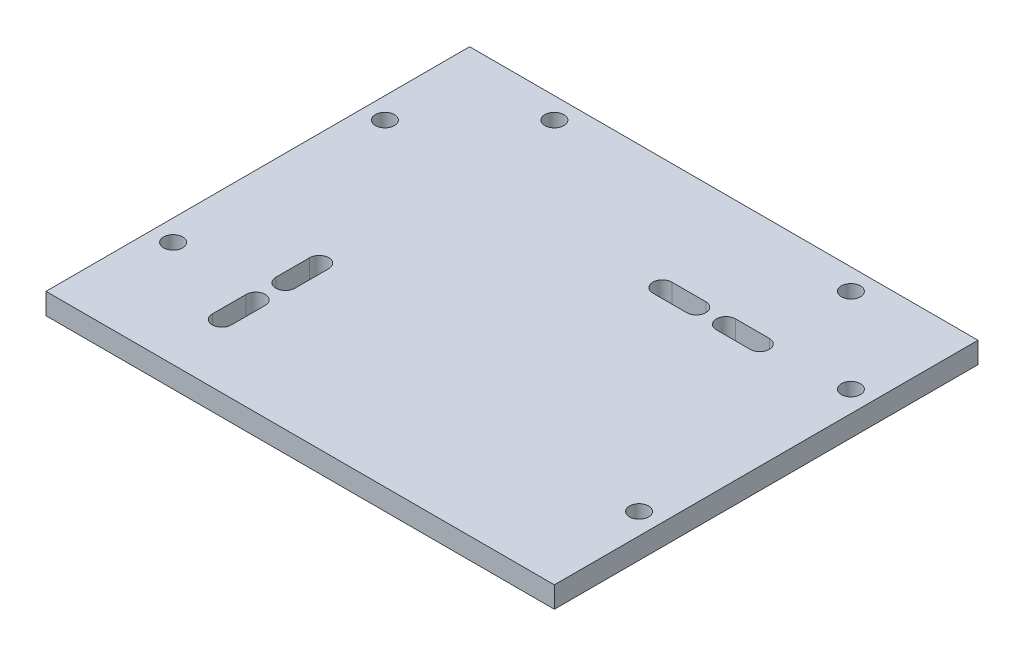
ISO-10303-21;
HEADER;
FILE_DESCRIPTION(('STEP AP214'),'2;1');
FILE_NAME('part.step','',(''),(''),'','','');
FILE_SCHEMA(('AUTOMOTIVE_DESIGN { 1 0 10303 214 1 1 1 1 }'));
ENDSEC;
DATA;
#1=APPLICATION_CONTEXT('core data for automotive mechanical design processes');
#2=APPLICATION_PROTOCOL_DEFINITION('international standard','automotive_design',2000,#1);
#3=PRODUCT_CONTEXT('',#1,'mechanical');
#4=PRODUCT('Part','Part','',(#3));
#5=PRODUCT_RELATED_PRODUCT_CATEGORY('part','',(#4));
#6=PRODUCT_DEFINITION_FORMATION('','',#4);
#7=PRODUCT_DEFINITION_CONTEXT('part definition',#1,'design');
#8=PRODUCT_DEFINITION('design','',#6,#7);
#9=PRODUCT_DEFINITION_SHAPE('','',#8);
#10=(LENGTH_UNIT() NAMED_UNIT(*) SI_UNIT(.MILLI.,.METRE.));
#11=(NAMED_UNIT(*) PLANE_ANGLE_UNIT() SI_UNIT($,.RADIAN.));
#12=(NAMED_UNIT(*) SI_UNIT($,.STERADIAN.) SOLID_ANGLE_UNIT());
#13=UNCERTAINTY_MEASURE_WITH_UNIT(LENGTH_MEASURE(1.E-05),#10,'distance_accuracy_value','');
#14=(GEOMETRIC_REPRESENTATION_CONTEXT(3) GLOBAL_UNCERTAINTY_ASSIGNED_CONTEXT((#13)) GLOBAL_UNIT_ASSIGNED_CONTEXT((#10,
#11,#12)) REPRESENTATION_CONTEXT('',''));
#15=CARTESIAN_POINT('',(0.,0.,0.));
#16=DIRECTION('',(0.,0.,1.));
#17=DIRECTION('',(1.,0.,0.));
#18=AXIS2_PLACEMENT_3D('',#15,#16,#17);
#19=CARTESIAN_POINT('',(0.,0.,0.));
#20=DIRECTION('',(0.,1.,0.));
#21=DIRECTION('',(0.,0.,1.));
#22=AXIS2_PLACEMENT_3D('',#19,#20,#21);
#23=PLANE('',#22);
#24=DIRECTION('',(1.,0.,0.));
#25=VECTOR('',#24,1.);
#26=CARTESIAN_POINT('',(27.,0.,-25.7500000000002));
#27=LINE('',#26,#25);
#28=CARTESIAN_POINT('',(27.,0.,-25.7500000000001));
#29=VERTEX_POINT('',#28);
#30=CARTESIAN_POINT('',(35.,0.,-25.7500000000002));
#31=VERTEX_POINT('',#30);
#32=EDGE_CURVE('E554',#29,#31,#27,.T.);
#33=ORIENTED_EDGE('',*,*,#32,.F.);
#34=CARTESIAN_POINT('',(27.,0.,-23.5000000000001));
#35=DIRECTION('',(0.,-1.,0.));
#36=DIRECTION('',(0.,0.,-1.));
#37=AXIS2_PLACEMENT_3D('',#34,#35,#36);
#38=CIRCLE('',#37,2.24999999999999);
#39=CARTESIAN_POINT('',(27.,0.,-21.2500000000001));
#40=VERTEX_POINT('',#39);
#41=EDGE_CURVE('E561',#40,#29,#38,.T.);
#42=ORIENTED_EDGE('',*,*,#41,.F.);
#43=DIRECTION('',(1.,0.,0.));
#44=VECTOR('',#43,1.);
#45=CARTESIAN_POINT('',(27.,0.,-21.2500000000001));
#46=LINE('',#45,#44);
#47=CARTESIAN_POINT('',(35.,0.,-21.2500000000001));
#48=VERTEX_POINT('',#47);
#49=EDGE_CURVE('E557',#40,#48,#46,.T.);
#50=ORIENTED_EDGE('',*,*,#49,.T.);
#51=CARTESIAN_POINT('',(35.,0.,-23.5000000000001));
#52=DIRECTION('',(0.,-1.,0.));
#53=DIRECTION('',(0.,0.,-1.));
#54=AXIS2_PLACEMENT_3D('',#51,#52,#53);
#55=CIRCLE('',#54,2.24999999999999);
#56=EDGE_CURVE('E571',#31,#48,#55,.T.);
#57=ORIENTED_EDGE('',*,*,#56,.F.);
#58=EDGE_LOOP('',(#33,#42,#50,#57));
#59=FACE_BOUND('',#58,.T.);
#60=CARTESIAN_POINT('',(-33.5000000000001,0.,12.));
#61=DIRECTION('',(0.,1.,0.));
#62=DIRECTION('',(0.,0.,1.));
#63=AXIS2_PLACEMENT_3D('',#60,#61,#62);
#64=CIRCLE('',#63,2.25);
#65=CARTESIAN_POINT('',(-31.2500000000001,0.,12.));
#66=VERTEX_POINT('',#65);
#67=CARTESIAN_POINT('',(-35.75,0.,12.));
#68=VERTEX_POINT('',#67);
#69=EDGE_CURVE('E752',#66,#68,#64,.T.);
#70=ORIENTED_EDGE('',*,*,#69,.T.);
#71=DIRECTION('',(0.,0.,1.));
#72=VECTOR('',#71,1.);
#73=CARTESIAN_POINT('',(-35.75,0.,0.));
#74=LINE('',#73,#72);
#75=CARTESIAN_POINT('',(-35.75,0.,20.));
#76=VERTEX_POINT('',#75);
#77=EDGE_CURVE('E756',#68,#76,#74,.T.);
#78=ORIENTED_EDGE('',*,*,#77,.T.);
#79=CARTESIAN_POINT('',(-33.5000000000001,0.,20.));
#80=DIRECTION('',(0.,1.,0.));
#81=DIRECTION('',(0.,0.,1.));
#82=AXIS2_PLACEMENT_3D('',#79,#80,#81);
#83=CIRCLE('',#82,2.25);
#84=CARTESIAN_POINT('',(-31.2500000000001,0.,20.));
#85=VERTEX_POINT('',#84);
#86=EDGE_CURVE('E748',#76,#85,#83,.T.);
#87=ORIENTED_EDGE('',*,*,#86,.T.);
#88=DIRECTION('',(0.,0.,-1.));
#89=VECTOR('',#88,1.);
#90=CARTESIAN_POINT('',(-31.2500000000001,0.,0.));
#91=LINE('',#90,#89);
#92=EDGE_CURVE('E744',#85,#66,#91,.T.);
#93=ORIENTED_EDGE('',*,*,#92,.T.);
#94=EDGE_LOOP('',(#70,#78,#87,#93));
#95=FACE_BOUND('',#94,.T.);
#96=CARTESIAN_POINT('',(-33.5,0.,27.));
#97=DIRECTION('',(0.,1.,0.));
#98=DIRECTION('',(0.,0.,1.));
#99=AXIS2_PLACEMENT_3D('',#96,#97,#98);
#100=CIRCLE('',#99,2.25);
#101=CARTESIAN_POINT('',(-31.25,0.,27.));
#102=VERTEX_POINT('',#101);
#103=CARTESIAN_POINT('',(-35.75,0.,27.));
#104=VERTEX_POINT('',#103);
#105=EDGE_CURVE('E736',#102,#104,#100,.T.);
#106=ORIENTED_EDGE('',*,*,#105,.T.);
#107=DIRECTION('',(0.,0.,1.));
#108=VECTOR('',#107,1.);
#109=CARTESIAN_POINT('',(-35.75,0.,0.));
#110=LINE('',#109,#108);
#111=CARTESIAN_POINT('',(-35.75,0.,35.));
#112=VERTEX_POINT('',#111);
#113=EDGE_CURVE('E740',#104,#112,#110,.T.);
#114=ORIENTED_EDGE('',*,*,#113,.T.);
#115=CARTESIAN_POINT('',(-33.5,0.,35.));
#116=DIRECTION('',(0.,1.,0.));
#117=DIRECTION('',(0.,0.,1.));
#118=AXIS2_PLACEMENT_3D('',#115,#116,#117);
#119=CIRCLE('',#118,2.25);
#120=CARTESIAN_POINT('',(-31.25,0.,35.));
#121=VERTEX_POINT('',#120);
#122=EDGE_CURVE('E732',#112,#121,#119,.T.);
#123=ORIENTED_EDGE('',*,*,#122,.T.);
#124=DIRECTION('',(0.,0.,-1.));
#125=VECTOR('',#124,1.);
#126=CARTESIAN_POINT('',(-31.25,0.,0.));
#127=LINE('',#126,#125);
#128=EDGE_CURVE('E728',#121,#102,#127,.T.);
#129=ORIENTED_EDGE('',*,*,#128,.T.);
#130=EDGE_LOOP('',(#106,#114,#123,#129));
#131=FACE_BOUND('',#130,.T.);
#132=CARTESIAN_POINT('',(-35.,0.,-45.));
#133=DIRECTION('',(0.,1.,0.));
#134=DIRECTION('',(0.,0.,1.));
#135=AXIS2_PLACEMENT_3D('',#132,#133,#134);
#136=CIRCLE('',#135,2.25);
#137=CARTESIAN_POINT('',(-35.,0.,-42.75));
#138=VERTEX_POINT('',#137);
#139=EDGE_CURVE('E642',#138,#138,#136,.T.);
#140=ORIENTED_EDGE('',*,*,#139,.T.);
#141=EDGE_LOOP('',(#140));
#142=FACE_BOUND('',#141,.T.);
#143=CARTESIAN_POINT('',(-55.,0.,-25.));
#144=DIRECTION('',(0.,1.,0.));
#145=DIRECTION('',(0.,0.,1.));
#146=AXIS2_PLACEMENT_3D('',#143,#144,#145);
#147=CIRCLE('',#146,2.25);
#148=CARTESIAN_POINT('',(-55.,0.,-22.75));
#149=VERTEX_POINT('',#148);
#150=EDGE_CURVE('E650',#149,#149,#147,.T.);
#151=ORIENTED_EDGE('',*,*,#150,.T.);
#152=EDGE_LOOP('',(#151));
#153=FACE_BOUND('',#152,.T.);
#154=CARTESIAN_POINT('',(-55.,0.,25.));
#155=DIRECTION('',(0.,1.,0.));
#156=DIRECTION('',(0.,0.,1.));
#157=AXIS2_PLACEMENT_3D('',#154,#155,#156);
#158=CIRCLE('',#157,2.25);
#159=CARTESIAN_POINT('',(-55.,0.,27.25));
#160=VERTEX_POINT('',#159);
#161=EDGE_CURVE('E658',#160,#160,#158,.T.);
#162=ORIENTED_EDGE('',*,*,#161,.T.);
#163=EDGE_LOOP('',(#162));
#164=FACE_BOUND('',#163,.T.);
#165=CARTESIAN_POINT('',(55.,0.,25.));
#166=DIRECTION('',(0.,1.,0.));
#167=DIRECTION('',(0.,0.,1.));
#168=AXIS2_PLACEMENT_3D('',#165,#166,#167);
#169=CIRCLE('',#168,2.25);
#170=CARTESIAN_POINT('',(55.,0.,27.25));
#171=VERTEX_POINT('',#170);
#172=EDGE_CURVE('E666',#171,#171,#169,.T.);
#173=ORIENTED_EDGE('',*,*,#172,.T.);
#174=EDGE_LOOP('',(#173));
#175=FACE_BOUND('',#174,.T.);
#176=CARTESIAN_POINT('',(55.,0.,-25.));
#177=DIRECTION('',(0.,1.,0.));
#178=DIRECTION('',(0.,0.,1.));
#179=AXIS2_PLACEMENT_3D('',#176,#177,#178);
#180=CIRCLE('',#179,2.25);
#181=CARTESIAN_POINT('',(55.,0.,-22.75));
#182=VERTEX_POINT('',#181);
#183=EDGE_CURVE('E674',#182,#182,#180,.T.);
#184=ORIENTED_EDGE('',*,*,#183,.T.);
#185=EDGE_LOOP('',(#184));
#186=FACE_BOUND('',#185,.T.);
#187=CARTESIAN_POINT('',(35.,0.,-45.));
#188=DIRECTION('',(0.,1.,0.));
#189=DIRECTION('',(0.,0.,1.));
#190=AXIS2_PLACEMENT_3D('',#187,#188,#189);
#191=CIRCLE('',#190,2.25);
#192=CARTESIAN_POINT('',(35.,0.,-42.75));
#193=VERTEX_POINT('',#192);
#194=EDGE_CURVE('E682',#193,#193,#191,.T.);
#195=ORIENTED_EDGE('',*,*,#194,.T.);
#196=EDGE_LOOP('',(#195));
#197=FACE_BOUND('',#196,.T.);
#198=DIRECTION('',(0.,0.,1.));
#199=VECTOR('',#198,1.);
#200=CARTESIAN_POINT('',(-60.,0.,-50.));
#201=LINE('',#200,#199);
#202=CARTESIAN_POINT('',(-60.,0.,-50.));
#203=VERTEX_POINT('',#202);
#204=CARTESIAN_POINT('',(-60.,0.,50.));
#205=VERTEX_POINT('',#204);
#206=EDGE_CURVE('E686',#203,#205,#201,.T.);
#207=ORIENTED_EDGE('',*,*,#206,.F.);
#208=DIRECTION('',(-1.,0.,0.));
#209=VECTOR('',#208,1.);
#210=CARTESIAN_POINT('',(-60.,0.,-50.));
#211=LINE('',#210,#209);
#212=CARTESIAN_POINT('',(60.,0.,-50.));
#213=VERTEX_POINT('',#212);
#214=EDGE_CURVE('E692',#213,#203,#211,.T.);
#215=ORIENTED_EDGE('',*,*,#214,.F.);
#216=DIRECTION('',(0.,0.,-1.));
#217=VECTOR('',#216,1.);
#218=CARTESIAN_POINT('',(60.,0.,-50.));
#219=LINE('',#218,#217);
#220=CARTESIAN_POINT('',(60.,0.,50.));
#221=VERTEX_POINT('',#220);
#222=EDGE_CURVE('E708',#221,#213,#219,.T.);
#223=ORIENTED_EDGE('',*,*,#222,.F.);
#224=DIRECTION('',(1.,0.,0.));
#225=VECTOR('',#224,1.);
#226=CARTESIAN_POINT('',(-60.,0.,50.));
#227=LINE('',#226,#225);
#228=EDGE_CURVE('E705',#205,#221,#227,.T.);
#229=ORIENTED_EDGE('',*,*,#228,.F.);
#230=EDGE_LOOP('',(#207,#215,#223,#229));
#231=FACE_BOUND('',#230,.T.);
#232=DIRECTION('',(1.,0.,0.));
#233=VECTOR('',#232,1.);
#234=CARTESIAN_POINT('',(12.,0.,-25.7500000000002));
#235=LINE('',#234,#233);
#236=CARTESIAN_POINT('',(12.,0.,-25.7500000000001));
#237=VERTEX_POINT('',#236);
#238=CARTESIAN_POINT('',(20.,0.,-25.7500000000002));
#239=VERTEX_POINT('',#238);
#240=EDGE_CURVE('E540',#237,#239,#235,.T.);
#241=ORIENTED_EDGE('',*,*,#240,.F.);
#242=CARTESIAN_POINT('',(12.,0.,-23.5000000000001));
#243=DIRECTION('',(0.,-1.,0.));
#244=DIRECTION('',(0.,0.,-1.));
#245=AXIS2_PLACEMENT_3D('',#242,#243,#244);
#246=CIRCLE('',#245,2.24999999999999);
#247=CARTESIAN_POINT('',(12.,0.,-21.2500000000001));
#248=VERTEX_POINT('',#247);
#249=EDGE_CURVE('E538',#248,#237,#246,.T.);
#250=ORIENTED_EDGE('',*,*,#249,.F.);
#251=DIRECTION('',(1.,0.,0.));
#252=VECTOR('',#251,1.);
#253=CARTESIAN_POINT('',(12.,0.,-21.2500000000001));
#254=LINE('',#253,#252);
#255=CARTESIAN_POINT('',(20.,0.,-21.2500000000001));
#256=VERTEX_POINT('',#255);
#257=EDGE_CURVE('E521',#248,#256,#254,.T.);
#258=ORIENTED_EDGE('',*,*,#257,.T.);
#259=CARTESIAN_POINT('',(20.,0.,-23.5000000000001));
#260=DIRECTION('',(0.,-1.,0.));
#261=DIRECTION('',(0.,0.,-1.));
#262=AXIS2_PLACEMENT_3D('',#259,#260,#261);
#263=CIRCLE('',#262,2.24999999999999);
#264=EDGE_CURVE('E528',#239,#256,#263,.T.);
#265=ORIENTED_EDGE('',*,*,#264,.F.);
#266=EDGE_LOOP('',(#241,#250,#258,#265));
#267=FACE_BOUND('',#266,.T.);
#268=ADVANCED_FACE('F343',(#59,#95,#131,#142,#153,#164,#175,#186,#197,#231,#267),#23,.F.);
#269=CARTESIAN_POINT('',(-60.,5.,-50.));
#270=DIRECTION('',(1.,0.,0.));
#271=DIRECTION('',(0.,0.,-1.));
#272=AXIS2_PLACEMENT_3D('',#269,#270,#271);
#273=PLANE('',#272);
#274=ORIENTED_EDGE('',*,*,#206,.T.);
#275=DIRECTION('',(0.,-1.,0.));
#276=VECTOR('',#275,1.);
#277=CARTESIAN_POINT('',(-60.,5.,50.));
#278=LINE('',#277,#276);
#279=CARTESIAN_POINT('',(-60.,5.,50.));
#280=VERTEX_POINT('',#279);
#281=EDGE_CURVE('E724',#280,#205,#278,.T.);
#282=ORIENTED_EDGE('',*,*,#281,.F.);
#283=DIRECTION('',(0.,0.,1.));
#284=VECTOR('',#283,1.);
#285=CARTESIAN_POINT('',(-60.,5.,-50.));
#286=LINE('',#285,#284);
#287=CARTESIAN_POINT('',(-60.,5.,-50.));
#288=VERTEX_POINT('',#287);
#289=EDGE_CURVE('E687',#288,#280,#286,.T.);
#290=ORIENTED_EDGE('',*,*,#289,.F.);
#291=DIRECTION('',(0.,-1.,0.));
#292=VECTOR('',#291,1.);
#293=CARTESIAN_POINT('',(-60.,5.,-50.));
#294=LINE('',#293,#292);
#295=EDGE_CURVE('E701',#288,#203,#294,.T.);
#296=ORIENTED_EDGE('',*,*,#295,.T.);
#297=EDGE_LOOP('',(#274,#282,#290,#296));
#298=FACE_BOUND('',#297,.T.);
#299=ADVANCED_FACE('F345',(#298),#273,.F.);
#300=CARTESIAN_POINT('',(-60.,5.,50.));
#301=DIRECTION('',(0.,0.,-1.));
#302=DIRECTION('',(-1.,0.,0.));
#303=AXIS2_PLACEMENT_3D('',#300,#301,#302);
#304=PLANE('',#303);
#305=ORIENTED_EDGE('',*,*,#228,.T.);
#306=DIRECTION('',(0.,-1.,0.));
#307=VECTOR('',#306,1.);
#308=CARTESIAN_POINT('',(60.,5.,50.));
#309=LINE('',#308,#307);
#310=CARTESIAN_POINT('',(60.,5.,50.));
#311=VERTEX_POINT('',#310);
#312=EDGE_CURVE('E720',#311,#221,#309,.T.);
#313=ORIENTED_EDGE('',*,*,#312,.F.);
#314=DIRECTION('',(1.,0.,0.));
#315=VECTOR('',#314,1.);
#316=CARTESIAN_POINT('',(-60.,5.,50.));
#317=LINE('',#316,#315);
#318=EDGE_CURVE('E691',#280,#311,#317,.T.);
#319=ORIENTED_EDGE('',*,*,#318,.F.);
#320=ORIENTED_EDGE('',*,*,#281,.T.);
#321=EDGE_LOOP('',(#305,#313,#319,#320));
#322=FACE_BOUND('',#321,.T.);
#323=ADVANCED_FACE('F803',(#322),#304,.F.);
#324=CARTESIAN_POINT('',(60.,5.,-50.));
#325=DIRECTION('',(-1.,0.,0.));
#326=DIRECTION('',(0.,0.,1.));
#327=AXIS2_PLACEMENT_3D('',#324,#325,#326);
#328=PLANE('',#327);
#329=ORIENTED_EDGE('',*,*,#222,.T.);
#330=DIRECTION('',(0.,-1.,0.));
#331=VECTOR('',#330,1.);
#332=CARTESIAN_POINT('',(60.,5.,-50.));
#333=LINE('',#332,#331);
#334=CARTESIAN_POINT('',(60.,5.,-50.));
#335=VERTEX_POINT('',#334);
#336=EDGE_CURVE('E716',#335,#213,#333,.T.);
#337=ORIENTED_EDGE('',*,*,#336,.F.);
#338=DIRECTION('',(0.,0.,-1.));
#339=VECTOR('',#338,1.);
#340=CARTESIAN_POINT('',(60.,5.,-50.));
#341=LINE('',#340,#339);
#342=EDGE_CURVE('E695',#311,#335,#341,.T.);
#343=ORIENTED_EDGE('',*,*,#342,.F.);
#344=ORIENTED_EDGE('',*,*,#312,.T.);
#345=EDGE_LOOP('',(#329,#337,#343,#344));
#346=FACE_BOUND('',#345,.T.);
#347=ADVANCED_FACE('F813',(#346),#328,.F.);
#348=CARTESIAN_POINT('',(-60.,5.,-50.));
#349=DIRECTION('',(0.,0.,1.));
#350=DIRECTION('',(1.,0.,0.));
#351=AXIS2_PLACEMENT_3D('',#348,#349,#350);
#352=PLANE('',#351);
#353=ORIENTED_EDGE('',*,*,#214,.T.);
#354=ORIENTED_EDGE('',*,*,#295,.F.);
#355=DIRECTION('',(-1.,0.,0.));
#356=VECTOR('',#355,1.);
#357=CARTESIAN_POINT('',(-60.,5.,-50.));
#358=LINE('',#357,#356);
#359=EDGE_CURVE('E698',#335,#288,#358,.T.);
#360=ORIENTED_EDGE('',*,*,#359,.F.);
#361=ORIENTED_EDGE('',*,*,#336,.T.);
#362=EDGE_LOOP('',(#353,#354,#360,#361));
#363=FACE_BOUND('',#362,.T.);
#364=ADVANCED_FACE('F810',(#363),#352,.F.);
#365=CARTESIAN_POINT('',(0.,5.,0.));
#366=DIRECTION('',(0.,1.,0.));
#367=DIRECTION('',(0.,0.,1.));
#368=AXIS2_PLACEMENT_3D('',#365,#366,#367);
#369=PLANE('',#368);
#370=DIRECTION('',(1.,0.,0.));
#371=VECTOR('',#370,1.);
#372=CARTESIAN_POINT('',(0.,5.,-21.2500000000001));
#373=LINE('',#372,#371);
#374=CARTESIAN_POINT('',(12.,5.,-21.2500000000001));
#375=VERTEX_POINT('',#374);
#376=CARTESIAN_POINT('',(20.,5.,-21.2500000000001));
#377=VERTEX_POINT('',#376);
#378=EDGE_CURVE('E13',#375,#377,#373,.T.);
#379=ORIENTED_EDGE('',*,*,#378,.F.);
#380=CARTESIAN_POINT('',(12.,5.,-23.5000000000001));
#381=DIRECTION('',(0.,1.,0.));
#382=DIRECTION('',(0.,0.,1.));
#383=AXIS2_PLACEMENT_3D('',#380,#381,#382);
#384=CIRCLE('',#383,2.24999999999999);
#385=CARTESIAN_POINT('',(12.,5.,-25.7500000000001));
#386=VERTEX_POINT('',#385);
#387=EDGE_CURVE('E776',#386,#375,#384,.T.);
#388=ORIENTED_EDGE('',*,*,#387,.F.);
#389=DIRECTION('',(-1.,0.,0.));
#390=VECTOR('',#389,1.);
#391=CARTESIAN_POINT('',(0.,5.,-25.7500000000001));
#392=LINE('',#391,#390);
#393=CARTESIAN_POINT('',(20.,5.,-25.7500000000001));
#394=VERTEX_POINT('',#393);
#395=EDGE_CURVE('E773',#394,#386,#392,.T.);
#396=ORIENTED_EDGE('',*,*,#395,.F.);
#397=CARTESIAN_POINT('',(20.,5.,-23.5000000000001));
#398=DIRECTION('',(0.,1.,0.));
#399=DIRECTION('',(0.,0.,1.));
#400=AXIS2_PLACEMENT_3D('',#397,#398,#399);
#401=CIRCLE('',#400,2.24999999999999);
#402=EDGE_CURVE('E352',#377,#394,#401,.T.);
#403=ORIENTED_EDGE('',*,*,#402,.F.);
#404=EDGE_LOOP('',(#379,#388,#396,#403));
#405=FACE_BOUND('',#404,.T.);
#406=DIRECTION('',(1.,0.,0.));
#407=VECTOR('',#406,1.);
#408=CARTESIAN_POINT('',(0.,5.,-21.2500000000001));
#409=LINE('',#408,#407);
#410=CARTESIAN_POINT('',(27.,5.,-21.2500000000001));
#411=VERTEX_POINT('',#410);
#412=CARTESIAN_POINT('',(35.,5.,-21.2500000000001));
#413=VERTEX_POINT('',#412);
#414=EDGE_CURVE('E770',#411,#413,#409,.T.);
#415=ORIENTED_EDGE('',*,*,#414,.F.);
#416=CARTESIAN_POINT('',(27.,5.,-23.5000000000001));
#417=DIRECTION('',(0.,1.,0.));
#418=DIRECTION('',(0.,0.,1.));
#419=AXIS2_PLACEMENT_3D('',#416,#417,#418);
#420=CIRCLE('',#419,2.25);
#421=CARTESIAN_POINT('',(27.,5.,-25.7500000000001));
#422=VERTEX_POINT('',#421);
#423=EDGE_CURVE('E764',#422,#411,#420,.T.);
#424=ORIENTED_EDGE('',*,*,#423,.F.);
#425=DIRECTION('',(-1.,0.,0.));
#426=VECTOR('',#425,1.);
#427=CARTESIAN_POINT('',(0.,5.,-25.7500000000001));
#428=LINE('',#427,#426);
#429=CARTESIAN_POINT('',(35.,5.,-25.7500000000001));
#430=VERTEX_POINT('',#429);
#431=EDGE_CURVE('E760',#430,#422,#428,.T.);
#432=ORIENTED_EDGE('',*,*,#431,.F.);
#433=CARTESIAN_POINT('',(35.,5.,-23.5000000000001));
#434=DIRECTION('',(0.,1.,0.));
#435=DIRECTION('',(0.,0.,1.));
#436=AXIS2_PLACEMENT_3D('',#433,#434,#435);
#437=CIRCLE('',#436,2.25);
#438=EDGE_CURVE('E767',#413,#430,#437,.T.);
#439=ORIENTED_EDGE('',*,*,#438,.F.);
#440=EDGE_LOOP('',(#415,#424,#432,#439));
#441=FACE_BOUND('',#440,.T.);
#442=DIRECTION('',(0.,0.,-1.));
#443=VECTOR('',#442,1.);
#444=CARTESIAN_POINT('',(-31.2500000000001,5.,20.));
#445=LINE('',#444,#443);
#446=CARTESIAN_POINT('',(-31.2500000000001,5.,20.));
#447=VERTEX_POINT('',#446);
#448=CARTESIAN_POINT('',(-31.2500000000001,5.,12.));
#449=VERTEX_POINT('',#448);
#450=EDGE_CURVE('E582',#447,#449,#445,.T.);
#451=ORIENTED_EDGE('',*,*,#450,.F.);
#452=CARTESIAN_POINT('',(-33.5000000000001,5.,20.));
#453=DIRECTION('',(0.,1.,0.));
#454=DIRECTION('',(0.,0.,1.));
#455=AXIS2_PLACEMENT_3D('',#452,#453,#454);
#456=CIRCLE('',#455,2.24999999999999);
#457=CARTESIAN_POINT('',(-35.75,5.,20.));
#458=VERTEX_POINT('',#457);
#459=EDGE_CURVE('E592',#458,#447,#456,.T.);
#460=ORIENTED_EDGE('',*,*,#459,.F.);
#461=DIRECTION('',(0.,0.,-1.));
#462=VECTOR('',#461,1.);
#463=CARTESIAN_POINT('',(-35.75,5.,20.));
#464=LINE('',#463,#462);
#465=CARTESIAN_POINT('',(-35.75,5.,12.));
#466=VERTEX_POINT('',#465);
#467=EDGE_CURVE('E585',#458,#466,#464,.T.);
#468=ORIENTED_EDGE('',*,*,#467,.T.);
#469=CARTESIAN_POINT('',(-33.5000000000001,5.,12.));
#470=DIRECTION('',(0.,1.,0.));
#471=DIRECTION('',(0.,0.,1.));
#472=AXIS2_PLACEMENT_3D('',#469,#470,#471);
#473=CIRCLE('',#472,2.24999999999999);
#474=EDGE_CURVE('E603',#449,#466,#473,.T.);
#475=ORIENTED_EDGE('',*,*,#474,.F.);
#476=EDGE_LOOP('',(#451,#460,#468,#475));
#477=FACE_BOUND('',#476,.T.);
#478=DIRECTION('',(0.,0.,-1.));
#479=VECTOR('',#478,1.);
#480=CARTESIAN_POINT('',(-31.2500000000001,5.,35.));
#481=LINE('',#480,#479);
#482=CARTESIAN_POINT('',(-31.2500000000001,5.,35.));
#483=VERTEX_POINT('',#482);
#484=CARTESIAN_POINT('',(-31.2500000000001,5.,27.));
#485=VERTEX_POINT('',#484);
#486=EDGE_CURVE('E610',#483,#485,#481,.T.);
#487=ORIENTED_EDGE('',*,*,#486,.F.);
#488=CARTESIAN_POINT('',(-33.5,5.,35.));
#489=DIRECTION('',(0.,1.,0.));
#490=DIRECTION('',(0.,0.,1.));
#491=AXIS2_PLACEMENT_3D('',#488,#489,#490);
#492=CIRCLE('',#491,2.24999999999999);
#493=CARTESIAN_POINT('',(-35.75,5.,35.));
#494=VERTEX_POINT('',#493);
#495=EDGE_CURVE('E620',#494,#483,#492,.T.);
#496=ORIENTED_EDGE('',*,*,#495,.F.);
#497=DIRECTION('',(0.,0.,-1.));
#498=VECTOR('',#497,1.);
#499=CARTESIAN_POINT('',(-35.75,5.,35.));
#500=LINE('',#499,#498);
#501=CARTESIAN_POINT('',(-35.75,5.,27.));
#502=VERTEX_POINT('',#501);
#503=EDGE_CURVE('E613',#494,#502,#500,.T.);
#504=ORIENTED_EDGE('',*,*,#503,.T.);
#505=CARTESIAN_POINT('',(-33.5,5.,27.));
#506=DIRECTION('',(0.,1.,0.));
#507=DIRECTION('',(0.,0.,1.));
#508=AXIS2_PLACEMENT_3D('',#505,#506,#507);
#509=CIRCLE('',#508,2.24999999999999);
#510=EDGE_CURVE('E631',#485,#502,#509,.T.);
#511=ORIENTED_EDGE('',*,*,#510,.F.);
#512=EDGE_LOOP('',(#487,#496,#504,#511));
#513=FACE_BOUND('',#512,.T.);
#514=CARTESIAN_POINT('',(-35.,5.,-45.));
#515=DIRECTION('',(0.,1.,0.));
#516=DIRECTION('',(0.,0.,1.));
#517=AXIS2_PLACEMENT_3D('',#514,#515,#516);
#518=CIRCLE('',#517,2.25);
#519=CARTESIAN_POINT('',(-35.,5.,-42.75));
#520=VERTEX_POINT('',#519);
#521=EDGE_CURVE('E638',#520,#520,#518,.T.);
#522=ORIENTED_EDGE('',*,*,#521,.F.);
#523=EDGE_LOOP('',(#522));
#524=FACE_BOUND('',#523,.T.);
#525=CARTESIAN_POINT('',(-55.,5.,-25.));
#526=DIRECTION('',(0.,1.,0.));
#527=DIRECTION('',(0.,0.,1.));
#528=AXIS2_PLACEMENT_3D('',#525,#526,#527);
#529=CIRCLE('',#528,2.25);
#530=CARTESIAN_POINT('',(-55.,5.,-22.75));
#531=VERTEX_POINT('',#530);
#532=EDGE_CURVE('E646',#531,#531,#529,.T.);
#533=ORIENTED_EDGE('',*,*,#532,.F.);
#534=EDGE_LOOP('',(#533));
#535=FACE_BOUND('',#534,.T.);
#536=CARTESIAN_POINT('',(-55.,5.,25.));
#537=DIRECTION('',(0.,1.,0.));
#538=DIRECTION('',(0.,0.,1.));
#539=AXIS2_PLACEMENT_3D('',#536,#537,#538);
#540=CIRCLE('',#539,2.25);
#541=CARTESIAN_POINT('',(-55.,5.,27.25));
#542=VERTEX_POINT('',#541);
#543=EDGE_CURVE('E654',#542,#542,#540,.T.);
#544=ORIENTED_EDGE('',*,*,#543,.F.);
#545=EDGE_LOOP('',(#544));
#546=FACE_BOUND('',#545,.T.);
#547=CARTESIAN_POINT('',(55.,5.,25.));
#548=DIRECTION('',(0.,1.,0.));
#549=DIRECTION('',(0.,0.,1.));
#550=AXIS2_PLACEMENT_3D('',#547,#548,#549);
#551=CIRCLE('',#550,2.25);
#552=CARTESIAN_POINT('',(55.,5.,27.25));
#553=VERTEX_POINT('',#552);
#554=EDGE_CURVE('E662',#553,#553,#551,.T.);
#555=ORIENTED_EDGE('',*,*,#554,.F.);
#556=EDGE_LOOP('',(#555));
#557=FACE_BOUND('',#556,.T.);
#558=CARTESIAN_POINT('',(55.,5.,-25.));
#559=DIRECTION('',(0.,1.,0.));
#560=DIRECTION('',(0.,0.,1.));
#561=AXIS2_PLACEMENT_3D('',#558,#559,#560);
#562=CIRCLE('',#561,2.25);
#563=CARTESIAN_POINT('',(55.,5.,-22.75));
#564=VERTEX_POINT('',#563);
#565=EDGE_CURVE('E670',#564,#564,#562,.T.);
#566=ORIENTED_EDGE('',*,*,#565,.F.);
#567=EDGE_LOOP('',(#566));
#568=FACE_BOUND('',#567,.T.);
#569=CARTESIAN_POINT('',(35.,5.,-45.));
#570=DIRECTION('',(0.,1.,0.));
#571=DIRECTION('',(0.,0.,1.));
#572=AXIS2_PLACEMENT_3D('',#569,#570,#571);
#573=CIRCLE('',#572,2.25);
#574=CARTESIAN_POINT('',(35.,5.,-42.75));
#575=VERTEX_POINT('',#574);
#576=EDGE_CURVE('E678',#575,#575,#573,.T.);
#577=ORIENTED_EDGE('',*,*,#576,.F.);
#578=EDGE_LOOP('',(#577));
#579=FACE_BOUND('',#578,.T.);
#580=ORIENTED_EDGE('',*,*,#289,.T.);
#581=ORIENTED_EDGE('',*,*,#318,.T.);
#582=ORIENTED_EDGE('',*,*,#342,.T.);
#583=ORIENTED_EDGE('',*,*,#359,.T.);
#584=EDGE_LOOP('',(#580,#581,#582,#583));
#585=FACE_BOUND('',#584,.T.);
#586=ADVANCED_FACE('F784',(#405,#441,#477,#513,#524,#535,#546,#557,#568,#579,#585),#369,.T.);
#587=CARTESIAN_POINT('',(35.,5.,-45.));
#588=DIRECTION('',(0.,1.,0.));
#589=DIRECTION('',(0.,0.,1.));
#590=AXIS2_PLACEMENT_3D('',#587,#588,#589);
#591=CYLINDRICAL_SURFACE('',#590,2.25);
#592=ORIENTED_EDGE('',*,*,#194,.F.);
#593=EDGE_LOOP('',(#592));
#594=FACE_BOUND('',#593,.T.);
#595=ORIENTED_EDGE('',*,*,#576,.T.);
#596=EDGE_LOOP('',(#595));
#597=FACE_BOUND('',#596,.T.);
#598=ADVANCED_FACE('F832',(#594,#597),#591,.F.);
#599=CARTESIAN_POINT('',(55.,5.,-25.));
#600=DIRECTION('',(0.,1.,0.));
#601=DIRECTION('',(0.,0.,1.));
#602=AXIS2_PLACEMENT_3D('',#599,#600,#601);
#603=CYLINDRICAL_SURFACE('',#602,2.25);
#604=ORIENTED_EDGE('',*,*,#183,.F.);
#605=EDGE_LOOP('',(#604));
#606=FACE_BOUND('',#605,.T.);
#607=ORIENTED_EDGE('',*,*,#565,.T.);
#608=EDGE_LOOP('',(#607));
#609=FACE_BOUND('',#608,.T.);
#610=ADVANCED_FACE('F835',(#606,#609),#603,.F.);
#611=CARTESIAN_POINT('',(55.,5.,25.));
#612=DIRECTION('',(0.,1.,0.));
#613=DIRECTION('',(0.,0.,1.));
#614=AXIS2_PLACEMENT_3D('',#611,#612,#613);
#615=CYLINDRICAL_SURFACE('',#614,2.25);
#616=ORIENTED_EDGE('',*,*,#172,.F.);
#617=EDGE_LOOP('',(#616));
#618=FACE_BOUND('',#617,.T.);
#619=ORIENTED_EDGE('',*,*,#554,.T.);
#620=EDGE_LOOP('',(#619));
#621=FACE_BOUND('',#620,.T.);
#622=ADVANCED_FACE('F841',(#618,#621),#615,.F.);
#623=CARTESIAN_POINT('',(-55.,5.,25.));
#624=DIRECTION('',(0.,1.,0.));
#625=DIRECTION('',(0.,0.,1.));
#626=AXIS2_PLACEMENT_3D('',#623,#624,#625);
#627=CYLINDRICAL_SURFACE('',#626,2.25);
#628=ORIENTED_EDGE('',*,*,#161,.F.);
#629=EDGE_LOOP('',(#628));
#630=FACE_BOUND('',#629,.T.);
#631=ORIENTED_EDGE('',*,*,#543,.T.);
#632=EDGE_LOOP('',(#631));
#633=FACE_BOUND('',#632,.T.);
#634=ADVANCED_FACE('F849',(#630,#633),#627,.F.);
#635=CARTESIAN_POINT('',(-55.,5.,-25.));
#636=DIRECTION('',(0.,1.,0.));
#637=DIRECTION('',(0.,0.,1.));
#638=AXIS2_PLACEMENT_3D('',#635,#636,#637);
#639=CYLINDRICAL_SURFACE('',#638,2.25);
#640=ORIENTED_EDGE('',*,*,#150,.F.);
#641=EDGE_LOOP('',(#640));
#642=FACE_BOUND('',#641,.T.);
#643=ORIENTED_EDGE('',*,*,#532,.T.);
#644=EDGE_LOOP('',(#643));
#645=FACE_BOUND('',#644,.T.);
#646=ADVANCED_FACE('F853',(#642,#645),#639,.F.);
#647=CARTESIAN_POINT('',(-35.,5.,-45.));
#648=DIRECTION('',(0.,1.,0.));
#649=DIRECTION('',(0.,0.,1.));
#650=AXIS2_PLACEMENT_3D('',#647,#648,#649);
#651=CYLINDRICAL_SURFACE('',#650,2.25);
#652=ORIENTED_EDGE('',*,*,#139,.F.);
#653=EDGE_LOOP('',(#652));
#654=FACE_BOUND('',#653,.T.);
#655=ORIENTED_EDGE('',*,*,#521,.T.);
#656=EDGE_LOOP('',(#655));
#657=FACE_BOUND('',#656,.T.);
#658=ADVANCED_FACE('F857',(#654,#657),#651,.F.);
#659=CARTESIAN_POINT('',(-33.5,5.,27.));
#660=DIRECTION('',(0.,1.,0.));
#661=DIRECTION('',(0.,0.,1.));
#662=AXIS2_PLACEMENT_3D('',#659,#660,#661);
#663=CYLINDRICAL_SURFACE('',#662,2.25);
#664=DIRECTION('',(0.,-1.,0.));
#665=VECTOR('',#664,1.);
#666=CARTESIAN_POINT('',(-31.25,-0.00100000000000013,27.));
#667=LINE('',#666,#665);
#668=EDGE_CURVE('E627',#485,#102,#667,.T.);
#669=ORIENTED_EDGE('',*,*,#668,.F.);
#670=ORIENTED_EDGE('',*,*,#510,.T.);
#671=DIRECTION('',(0.,1.,0.));
#672=VECTOR('',#671,1.);
#673=CARTESIAN_POINT('',(-35.75,5.,27.));
#674=LINE('',#673,#672);
#675=EDGE_CURVE('E635',#104,#502,#674,.T.);
#676=ORIENTED_EDGE('',*,*,#675,.F.);
#677=ORIENTED_EDGE('',*,*,#105,.F.);
#678=EDGE_LOOP('',(#669,#670,#676,#677));
#679=FACE_BOUND('',#678,.T.);
#680=ADVANCED_FACE('F861',(#679),#663,.F.);
#681=CARTESIAN_POINT('',(-33.5,5.,35.));
#682=DIRECTION('',(0.,1.,0.));
#683=DIRECTION('',(0.,0.,1.));
#684=AXIS2_PLACEMENT_3D('',#681,#682,#683);
#685=CYLINDRICAL_SURFACE('',#684,2.25);
#686=DIRECTION('',(0.,1.,0.));
#687=VECTOR('',#686,1.);
#688=CARTESIAN_POINT('',(-35.75,5.,35.));
#689=LINE('',#688,#687);
#690=EDGE_CURVE('E623',#494,#112,#689,.F.);
#691=ORIENTED_EDGE('',*,*,#690,.F.);
#692=ORIENTED_EDGE('',*,*,#495,.T.);
#693=DIRECTION('',(0.,-1.,0.));
#694=VECTOR('',#693,1.);
#695=CARTESIAN_POINT('',(-31.25,-0.00100000000000013,35.));
#696=LINE('',#695,#694);
#697=EDGE_CURVE('E617',#483,#121,#696,.T.);
#698=ORIENTED_EDGE('',*,*,#697,.T.);
#699=ORIENTED_EDGE('',*,*,#122,.F.);
#700=EDGE_LOOP('',(#691,#692,#698,#699));
#701=FACE_BOUND('',#700,.T.);
#702=ADVANCED_FACE('F865',(#701),#685,.F.);
#703=CARTESIAN_POINT('',(-35.75,5.,35.));
#704=DIRECTION('',(-1.,0.,0.));
#705=DIRECTION('',(0.,0.,1.));
#706=AXIS2_PLACEMENT_3D('',#703,#704,#705);
#707=PLANE('',#706);
#708=ORIENTED_EDGE('',*,*,#675,.T.);
#709=ORIENTED_EDGE('',*,*,#503,.F.);
#710=ORIENTED_EDGE('',*,*,#690,.T.);
#711=ORIENTED_EDGE('',*,*,#113,.F.);
#712=EDGE_LOOP('',(#708,#709,#710,#711));
#713=FACE_BOUND('',#712,.T.);
#714=ADVANCED_FACE('F869',(#713),#707,.F.);
#715=CARTESIAN_POINT('',(-31.25,-0.00100000000000013,35.));
#716=DIRECTION('',(1.,0.,0.));
#717=DIRECTION('',(0.,1.,0.));
#718=AXIS2_PLACEMENT_3D('',#715,#716,#717);
#719=PLANE('',#718);
#720=ORIENTED_EDGE('',*,*,#697,.F.);
#721=ORIENTED_EDGE('',*,*,#486,.T.);
#722=ORIENTED_EDGE('',*,*,#668,.T.);
#723=ORIENTED_EDGE('',*,*,#128,.F.);
#724=EDGE_LOOP('',(#720,#721,#722,#723));
#725=FACE_BOUND('',#724,.T.);
#726=ADVANCED_FACE('F873',(#725),#719,.F.);
#727=CARTESIAN_POINT('',(-33.5000000000001,5.,12.));
#728=DIRECTION('',(0.,1.,0.));
#729=DIRECTION('',(0.,0.,1.));
#730=AXIS2_PLACEMENT_3D('',#727,#728,#729);
#731=CYLINDRICAL_SURFACE('',#730,2.25);
#732=DIRECTION('',(0.,-1.,0.));
#733=VECTOR('',#732,1.);
#734=CARTESIAN_POINT('',(-31.2500000000001,-0.00100000000000013,12.));
#735=LINE('',#734,#733);
#736=EDGE_CURVE('E599',#449,#66,#735,.T.);
#737=ORIENTED_EDGE('',*,*,#736,.F.);
#738=ORIENTED_EDGE('',*,*,#474,.T.);
#739=DIRECTION('',(0.,1.,0.));
#740=VECTOR('',#739,1.);
#741=CARTESIAN_POINT('',(-35.75,5.,12.));
#742=LINE('',#741,#740);
#743=EDGE_CURVE('E607',#68,#466,#742,.T.);
#744=ORIENTED_EDGE('',*,*,#743,.F.);
#745=ORIENTED_EDGE('',*,*,#69,.F.);
#746=EDGE_LOOP('',(#737,#738,#744,#745));
#747=FACE_BOUND('',#746,.T.);
#748=ADVANCED_FACE('F877',(#747),#731,.F.);
#749=CARTESIAN_POINT('',(-33.5000000000001,5.,20.));
#750=DIRECTION('',(0.,1.,0.));
#751=DIRECTION('',(0.,0.,1.));
#752=AXIS2_PLACEMENT_3D('',#749,#750,#751);
#753=CYLINDRICAL_SURFACE('',#752,2.25);
#754=DIRECTION('',(0.,1.,0.));
#755=VECTOR('',#754,1.);
#756=CARTESIAN_POINT('',(-35.75,5.,20.));
#757=LINE('',#756,#755);
#758=EDGE_CURVE('E595',#458,#76,#757,.F.);
#759=ORIENTED_EDGE('',*,*,#758,.F.);
#760=ORIENTED_EDGE('',*,*,#459,.T.);
#761=DIRECTION('',(0.,-1.,0.));
#762=VECTOR('',#761,1.);
#763=CARTESIAN_POINT('',(-31.2500000000001,-0.00100000000000013,20.));
#764=LINE('',#763,#762);
#765=EDGE_CURVE('E589',#447,#85,#764,.T.);
#766=ORIENTED_EDGE('',*,*,#765,.T.);
#767=ORIENTED_EDGE('',*,*,#86,.F.);
#768=EDGE_LOOP('',(#759,#760,#766,#767));
#769=FACE_BOUND('',#768,.T.);
#770=ADVANCED_FACE('F881',(#769),#753,.F.);
#771=CARTESIAN_POINT('',(-35.75,5.,20.));
#772=DIRECTION('',(-1.,0.,0.));
#773=DIRECTION('',(0.,0.,1.));
#774=AXIS2_PLACEMENT_3D('',#771,#772,#773);
#775=PLANE('',#774);
#776=ORIENTED_EDGE('',*,*,#743,.T.);
#777=ORIENTED_EDGE('',*,*,#467,.F.);
#778=ORIENTED_EDGE('',*,*,#758,.T.);
#779=ORIENTED_EDGE('',*,*,#77,.F.);
#780=EDGE_LOOP('',(#776,#777,#778,#779));
#781=FACE_BOUND('',#780,.T.);
#782=ADVANCED_FACE('F885',(#781),#775,.F.);
#783=CARTESIAN_POINT('',(-31.2500000000001,-0.00100000000000013,20.));
#784=DIRECTION('',(1.,0.,0.));
#785=DIRECTION('',(0.,1.,0.));
#786=AXIS2_PLACEMENT_3D('',#783,#784,#785);
#787=PLANE('',#786);
#788=ORIENTED_EDGE('',*,*,#765,.F.);
#789=ORIENTED_EDGE('',*,*,#450,.T.);
#790=ORIENTED_EDGE('',*,*,#736,.T.);
#791=ORIENTED_EDGE('',*,*,#92,.F.);
#792=EDGE_LOOP('',(#788,#789,#790,#791));
#793=FACE_BOUND('',#792,.T.);
#794=ADVANCED_FACE('F889',(#793),#787,.F.);
#795=CARTESIAN_POINT('',(35.,0.,-23.5000000000001));
#796=DIRECTION('',(0.,-1.,0.));
#797=DIRECTION('',(0.,0.,-1.));
#798=AXIS2_PLACEMENT_3D('',#795,#796,#797);
#799=CYLINDRICAL_SURFACE('',#798,2.25);
#800=ORIENTED_EDGE('',*,*,#438,.T.);
#801=DIRECTION('',(0.,-1.,0.));
#802=VECTOR('',#801,1.);
#803=CARTESIAN_POINT('',(35.,0.,-25.7500000000001));
#804=LINE('',#803,#802);
#805=EDGE_CURVE('E578',#31,#430,#804,.F.);
#806=ORIENTED_EDGE('',*,*,#805,.F.);
#807=ORIENTED_EDGE('',*,*,#56,.T.);
#808=DIRECTION('',(0.,-1.,0.));
#809=VECTOR('',#808,1.);
#810=CARTESIAN_POINT('',(35.,0.,-21.2500000000001));
#811=LINE('',#810,#809);
#812=EDGE_CURVE('E575',#413,#48,#811,.T.);
#813=ORIENTED_EDGE('',*,*,#812,.F.);
#814=EDGE_LOOP('',(#800,#806,#807,#813));
#815=FACE_BOUND('',#814,.T.);
#816=ADVANCED_FACE('F893',(#815),#799,.F.);
#817=CARTESIAN_POINT('',(27.,0.,-23.5000000000001));
#818=DIRECTION('',(0.,-1.,0.));
#819=DIRECTION('',(0.,0.,-1.));
#820=AXIS2_PLACEMENT_3D('',#817,#818,#819);
#821=CYLINDRICAL_SURFACE('',#820,2.25);
#822=ORIENTED_EDGE('',*,*,#423,.T.);
#823=DIRECTION('',(0.,-1.,0.));
#824=VECTOR('',#823,1.);
#825=CARTESIAN_POINT('',(27.,0.,-21.2500000000001));
#826=LINE('',#825,#824);
#827=EDGE_CURVE('E568',#40,#411,#826,.F.);
#828=ORIENTED_EDGE('',*,*,#827,.F.);
#829=ORIENTED_EDGE('',*,*,#41,.T.);
#830=DIRECTION('',(0.,-1.,0.));
#831=VECTOR('',#830,1.);
#832=CARTESIAN_POINT('',(27.,0.,-25.7500000000001));
#833=LINE('',#832,#831);
#834=EDGE_CURVE('E565',#422,#29,#833,.T.);
#835=ORIENTED_EDGE('',*,*,#834,.F.);
#836=EDGE_LOOP('',(#822,#828,#829,#835));
#837=FACE_BOUND('',#836,.T.);
#838=ADVANCED_FACE('F897',(#837),#821,.F.);
#839=CARTESIAN_POINT('',(27.,0.,-21.2500000000001));
#840=DIRECTION('',(0.,0.,1.));
#841=DIRECTION('',(1.,0.,0.));
#842=AXIS2_PLACEMENT_3D('',#839,#840,#841);
#843=PLANE('',#842);
#844=ORIENTED_EDGE('',*,*,#414,.T.);
#845=ORIENTED_EDGE('',*,*,#812,.T.);
#846=ORIENTED_EDGE('',*,*,#49,.F.);
#847=ORIENTED_EDGE('',*,*,#827,.T.);
#848=EDGE_LOOP('',(#844,#845,#846,#847));
#849=FACE_BOUND('',#848,.T.);
#850=ADVANCED_FACE('F901',(#849),#843,.F.);
#851=CARTESIAN_POINT('',(27.,0.,-25.7500000000001));
#852=DIRECTION('',(0.,0.,-1.));
#853=DIRECTION('',(-1.,0.,0.));
#854=AXIS2_PLACEMENT_3D('',#851,#852,#853);
#855=PLANE('',#854);
#856=ORIENTED_EDGE('',*,*,#431,.T.);
#857=ORIENTED_EDGE('',*,*,#834,.T.);
#858=ORIENTED_EDGE('',*,*,#32,.T.);
#859=ORIENTED_EDGE('',*,*,#805,.T.);
#860=EDGE_LOOP('',(#856,#857,#858,#859));
#861=FACE_BOUND('',#860,.T.);
#862=ADVANCED_FACE('F794',(#861),#855,.F.);
#863=CARTESIAN_POINT('',(20.,0.,-23.5000000000001));
#864=DIRECTION('',(0.,-1.,0.));
#865=DIRECTION('',(0.,0.,-1.));
#866=AXIS2_PLACEMENT_3D('',#863,#864,#865);
#867=CYLINDRICAL_SURFACE('',#866,2.24999999999999);
#868=ORIENTED_EDGE('',*,*,#402,.T.);
#869=DIRECTION('',(0.,-1.,0.));
#870=VECTOR('',#869,1.);
#871=CARTESIAN_POINT('',(20.,0.,-25.7500000000001));
#872=LINE('',#871,#870);
#873=EDGE_CURVE('E527',#239,#394,#872,.F.);
#874=ORIENTED_EDGE('',*,*,#873,.F.);
#875=ORIENTED_EDGE('',*,*,#264,.T.);
#876=DIRECTION('',(0.,-1.,0.));
#877=VECTOR('',#876,1.);
#878=CARTESIAN_POINT('',(20.,0.,-21.2500000000001));
#879=LINE('',#878,#877);
#880=EDGE_CURVE('E517',#377,#256,#879,.T.);
#881=ORIENTED_EDGE('',*,*,#880,.F.);
#882=EDGE_LOOP('',(#868,#874,#875,#881));
#883=FACE_BOUND('',#882,.T.);
#884=ADVANCED_FACE('F532',(#883),#867,.F.);
#885=CARTESIAN_POINT('',(12.,0.,-23.5000000000001));
#886=DIRECTION('',(0.,-1.,0.));
#887=DIRECTION('',(0.,0.,-1.));
#888=AXIS2_PLACEMENT_3D('',#885,#886,#887);
#889=CYLINDRICAL_SURFACE('',#888,2.24999999999999);
#890=ORIENTED_EDGE('',*,*,#387,.T.);
#891=DIRECTION('',(0.,-1.,0.));
#892=VECTOR('',#891,1.);
#893=CARTESIAN_POINT('',(12.,0.,-21.2500000000001));
#894=LINE('',#893,#892);
#895=EDGE_CURVE('E362',#248,#375,#894,.F.);
#896=ORIENTED_EDGE('',*,*,#895,.F.);
#897=ORIENTED_EDGE('',*,*,#249,.T.);
#898=DIRECTION('',(0.,-1.,0.));
#899=VECTOR('',#898,1.);
#900=CARTESIAN_POINT('',(12.,0.,-25.7500000000001));
#901=LINE('',#900,#899);
#902=EDGE_CURVE('E370',#386,#237,#901,.T.);
#903=ORIENTED_EDGE('',*,*,#902,.F.);
#904=EDGE_LOOP('',(#890,#896,#897,#903));
#905=FACE_BOUND('',#904,.T.);
#906=ADVANCED_FACE('F786',(#905),#889,.F.);
#907=CARTESIAN_POINT('',(12.,0.,-21.2500000000001));
#908=DIRECTION('',(0.,0.,1.));
#909=DIRECTION('',(1.,0.,0.));
#910=AXIS2_PLACEMENT_3D('',#907,#908,#909);
#911=PLANE('',#910);
#912=ORIENTED_EDGE('',*,*,#378,.T.);
#913=ORIENTED_EDGE('',*,*,#880,.T.);
#914=ORIENTED_EDGE('',*,*,#257,.F.);
#915=ORIENTED_EDGE('',*,*,#895,.T.);
#916=EDGE_LOOP('',(#912,#913,#914,#915));
#917=FACE_BOUND('',#916,.T.);
#918=ADVANCED_FACE('F519',(#917),#911,.F.);
#919=CARTESIAN_POINT('',(12.,0.,-25.7500000000001));
#920=DIRECTION('',(0.,0.,-1.));
#921=DIRECTION('',(-1.,0.,0.));
#922=AXIS2_PLACEMENT_3D('',#919,#920,#921);
#923=PLANE('',#922);
#924=ORIENTED_EDGE('',*,*,#395,.T.);
#925=ORIENTED_EDGE('',*,*,#902,.T.);
#926=ORIENTED_EDGE('',*,*,#240,.T.);
#927=ORIENTED_EDGE('',*,*,#873,.T.);
#928=EDGE_LOOP('',(#924,#925,#926,#927));
#929=FACE_BOUND('',#928,.T.);
#930=ADVANCED_FACE('F782',(#929),#923,.F.);
#931=CLOSED_SHELL('',(#268,#299,#323,#347,#364,#586,#598,#610,#622,#634,#646,#658,#680,#702,
#714,#726,#748,#770,#782,#794,#816,#838,#850,#862,#884,#906,#918,#930));
#932=MANIFOLD_SOLID_BREP('B2',#931);
#933=ADVANCED_BREP_SHAPE_REPRESENTATION('',(#18,#932),#14);
#934=SHAPE_DEFINITION_REPRESENTATION(#9,#933);
ENDSEC;
END-ISO-10303-21;
